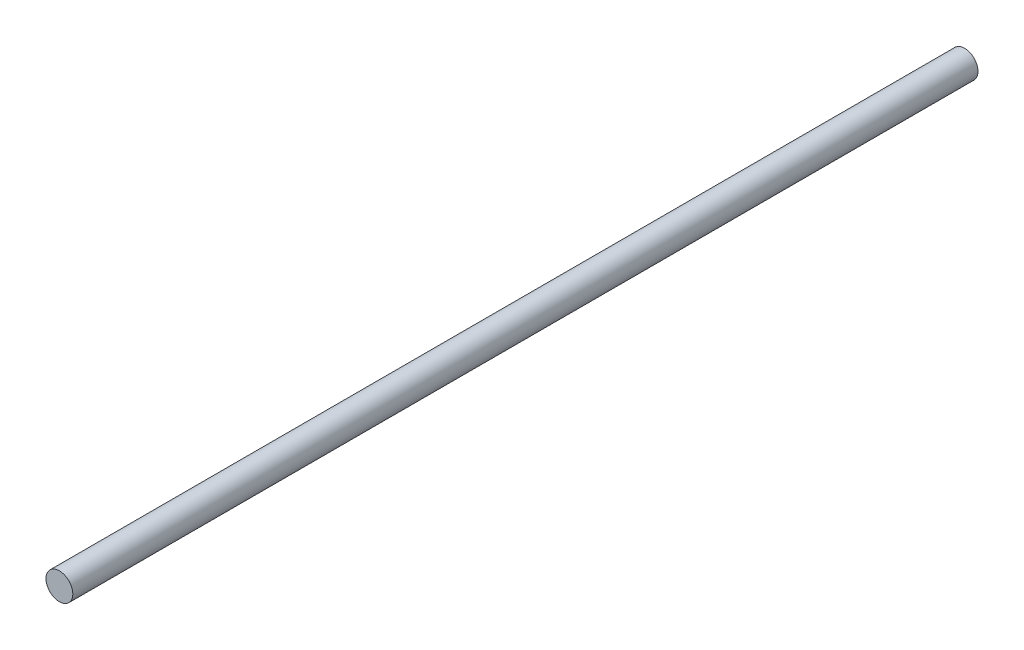
ISO-10303-21;
HEADER;
FILE_DESCRIPTION(('STEP AP214'),'2;1');
FILE_NAME('part.step','',(''),(''),'','','');
FILE_SCHEMA(('AUTOMOTIVE_DESIGN { 1 0 10303 214 1 1 1 1 }'));
ENDSEC;
DATA;
#1=APPLICATION_CONTEXT('core data for automotive mechanical design processes');
#2=APPLICATION_PROTOCOL_DEFINITION('international standard','automotive_design',2000,#1);
#3=PRODUCT_CONTEXT('',#1,'mechanical');
#4=PRODUCT('Part','Part','',(#3));
#5=PRODUCT_RELATED_PRODUCT_CATEGORY('part','',(#4));
#6=PRODUCT_DEFINITION_FORMATION('','',#4);
#7=PRODUCT_DEFINITION_CONTEXT('part definition',#1,'design');
#8=PRODUCT_DEFINITION('design','',#6,#7);
#9=PRODUCT_DEFINITION_SHAPE('','',#8);
#10=(LENGTH_UNIT() NAMED_UNIT(*) SI_UNIT(.MILLI.,.METRE.));
#11=(NAMED_UNIT(*) PLANE_ANGLE_UNIT() SI_UNIT($,.RADIAN.));
#12=(NAMED_UNIT(*) SI_UNIT($,.STERADIAN.) SOLID_ANGLE_UNIT());
#13=UNCERTAINTY_MEASURE_WITH_UNIT(LENGTH_MEASURE(1.E-05),#10,'distance_accuracy_value','');
#14=(GEOMETRIC_REPRESENTATION_CONTEXT(3) GLOBAL_UNCERTAINTY_ASSIGNED_CONTEXT((#13)) GLOBAL_UNIT_ASSIGNED_CONTEXT((#10,
#11,#12)) REPRESENTATION_CONTEXT('',''));
#15=CARTESIAN_POINT('',(0.,0.,0.));
#16=DIRECTION('',(0.,0.,1.));
#17=DIRECTION('',(1.,0.,0.));
#18=AXIS2_PLACEMENT_3D('',#15,#16,#17);
#19=CARTESIAN_POINT('',(0.,0.,405.));
#20=DIRECTION('',(0.,0.,-1.));
#21=DIRECTION('',(-1.,0.,0.));
#22=AXIS2_PLACEMENT_3D('',#19,#20,#21);
#23=CYLINDRICAL_SURFACE('',#22,6.);
#24=CARTESIAN_POINT('',(0.,0.,405.));
#25=DIRECTION('',(0.,0.,1.));
#26=DIRECTION('',(1.,0.,0.));
#27=AXIS2_PLACEMENT_3D('',#24,#25,#26);
#28=CIRCLE('',#27,6.);
#29=CARTESIAN_POINT('',(6.,0.,405.));
#30=VERTEX_POINT('',#29);
#31=EDGE_CURVE('E10',#30,#30,#28,.T.);
#32=ORIENTED_EDGE('',*,*,#31,.F.);
#33=EDGE_LOOP('',(#32));
#34=FACE_BOUND('',#33,.T.);
#35=CARTESIAN_POINT('',(0.,0.,0.));
#36=DIRECTION('',(0.,0.,1.));
#37=DIRECTION('',(1.,0.,0.));
#38=AXIS2_PLACEMENT_3D('',#35,#36,#37);
#39=CIRCLE('',#38,6.);
#40=CARTESIAN_POINT('',(6.,0.,0.));
#41=VERTEX_POINT('',#40);
#42=EDGE_CURVE('E42',#41,#41,#39,.T.);
#43=ORIENTED_EDGE('',*,*,#42,.T.);
#44=EDGE_LOOP('',(#43));
#45=FACE_BOUND('',#44,.T.);
#46=ADVANCED_FACE('F39',(#34,#45),#23,.T.);
#47=CARTESIAN_POINT('',(0.,0.,405.));
#48=DIRECTION('',(0.,0.,1.));
#49=DIRECTION('',(1.,0.,0.));
#50=AXIS2_PLACEMENT_3D('',#47,#48,#49);
#51=PLANE('',#50);
#52=ORIENTED_EDGE('',*,*,#31,.T.);
#53=EDGE_LOOP('',(#52));
#54=FACE_BOUND('',#53,.T.);
#55=ADVANCED_FACE('F56',(#54),#51,.T.);
#56=CARTESIAN_POINT('',(0.,0.,0.));
#57=DIRECTION('',(0.,0.,1.));
#58=DIRECTION('',(1.,0.,0.));
#59=AXIS2_PLACEMENT_3D('',#56,#57,#58);
#60=PLANE('',#59);
#61=ORIENTED_EDGE('',*,*,#42,.F.);
#62=EDGE_LOOP('',(#61));
#63=FACE_BOUND('',#62,.T.);
#64=ADVANCED_FACE('F54',(#63),#60,.F.);
#65=CLOSED_SHELL('',(#46,#55,#64));
#66=MANIFOLD_SOLID_BREP('B2',#65);
#67=ADVANCED_BREP_SHAPE_REPRESENTATION('',(#18,#66),#14);
#68=SHAPE_DEFINITION_REPRESENTATION(#9,#67);
ENDSEC;
END-ISO-10303-21;
